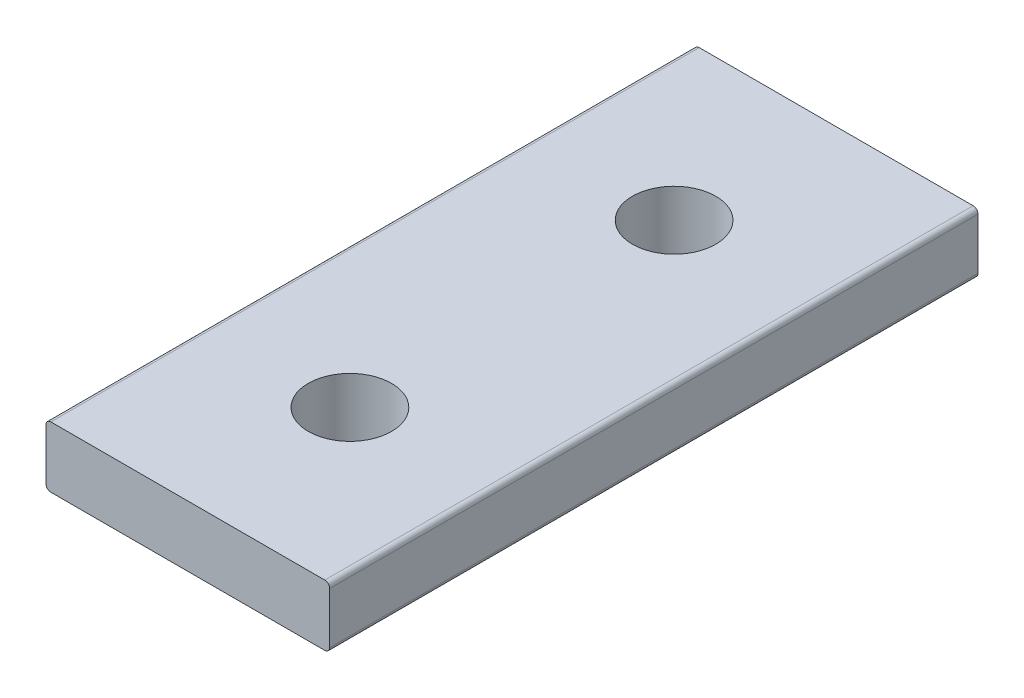
ISO-10303-21;
HEADER;
FILE_DESCRIPTION(('STEP AP214'),'2;1');
FILE_NAME('part.step','',(''),(''),'','','');
FILE_SCHEMA(('AUTOMOTIVE_DESIGN { 1 0 10303 214 1 1 1 1 }'));
ENDSEC;
DATA;
#1=APPLICATION_CONTEXT('core data for automotive mechanical design processes');
#2=APPLICATION_PROTOCOL_DEFINITION('international standard','automotive_design',2000,#1);
#3=PRODUCT_CONTEXT('',#1,'mechanical');
#4=PRODUCT('Part','Part','',(#3));
#5=PRODUCT_RELATED_PRODUCT_CATEGORY('part','',(#4));
#6=PRODUCT_DEFINITION_FORMATION('','',#4);
#7=PRODUCT_DEFINITION_CONTEXT('part definition',#1,'design');
#8=PRODUCT_DEFINITION('design','',#6,#7);
#9=PRODUCT_DEFINITION_SHAPE('','',#8);
#10=(LENGTH_UNIT() NAMED_UNIT(*) SI_UNIT(.MILLI.,.METRE.));
#11=(NAMED_UNIT(*) PLANE_ANGLE_UNIT() SI_UNIT($,.RADIAN.));
#12=(NAMED_UNIT(*) SI_UNIT($,.STERADIAN.) SOLID_ANGLE_UNIT());
#13=UNCERTAINTY_MEASURE_WITH_UNIT(LENGTH_MEASURE(1.E-05),#10,'distance_accuracy_value','');
#14=(GEOMETRIC_REPRESENTATION_CONTEXT(3) GLOBAL_UNCERTAINTY_ASSIGNED_CONTEXT((#13)) GLOBAL_UNIT_ASSIGNED_CONTEXT((#10,
#11,#12)) REPRESENTATION_CONTEXT('',''));
#15=CARTESIAN_POINT('',(0.,0.,0.));
#16=DIRECTION('',(0.,0.,1.));
#17=DIRECTION('',(1.,0.,0.));
#18=AXIS2_PLACEMENT_3D('',#15,#16,#17);
#19=CARTESIAN_POINT('',(-21.844,-4.3942,0.));
#20=DIRECTION('',(-1.,0.,0.));
#21=DIRECTION('',(0.,0.,1.));
#22=AXIS2_PLACEMENT_3D('',#19,#20,#21);
#23=PLANE('',#22);
#24=DIRECTION('',(0.,1.,0.));
#25=VECTOR('',#24,1.);
#26=CARTESIAN_POINT('',(-21.844,-4.7752,0.));
#27=LINE('',#26,#25);
#28=CARTESIAN_POINT('',(-21.844,-4.3942,0.));
#29=VERTEX_POINT('',#28);
#30=CARTESIAN_POINT('',(-21.844,-0.380999999999993,0.));
#31=VERTEX_POINT('',#30);
#32=EDGE_CURVE('E128',#29,#31,#27,.T.);
#33=ORIENTED_EDGE('',*,*,#32,.F.);
#34=DIRECTION('',(0.,0.,-1.));
#35=VECTOR('',#34,1.);
#36=CARTESIAN_POINT('',(-21.844,-4.3942,50.8));
#37=LINE('',#36,#35);
#38=CARTESIAN_POINT('',(-21.844,-4.3942,50.8));
#39=VERTEX_POINT('',#38);
#40=EDGE_CURVE('E121',#39,#29,#37,.T.);
#41=ORIENTED_EDGE('',*,*,#40,.F.);
#42=DIRECTION('',(0.,1.,0.));
#43=VECTOR('',#42,1.);
#44=CARTESIAN_POINT('',(-21.844,-4.7752,50.8));
#45=LINE('',#44,#43);
#46=CARTESIAN_POINT('',(-21.844,-0.380999999999993,50.8));
#47=VERTEX_POINT('',#46);
#48=EDGE_CURVE('E102',#47,#39,#45,.F.);
#49=ORIENTED_EDGE('',*,*,#48,.F.);
#50=DIRECTION('',(0.,0.,-1.));
#51=VECTOR('',#50,1.);
#52=CARTESIAN_POINT('',(-21.844,-0.380999999999993,50.8));
#53=LINE('',#52,#51);
#54=EDGE_CURVE('E87',#31,#47,#53,.F.);
#55=ORIENTED_EDGE('',*,*,#54,.F.);
#56=EDGE_LOOP('',(#33,#41,#49,#55));
#57=FACE_BOUND('',#56,.T.);
#58=ADVANCED_FACE('F15',(#57),#23,.T.);
#59=CARTESIAN_POINT('',(0.381000000000015,-4.3942,50.8));
#60=DIRECTION('',(1.,0.,0.));
#61=DIRECTION('',(0.,0.,-1.));
#62=AXIS2_PLACEMENT_3D('',#59,#60,#61);
#63=PLANE('',#62);
#64=DIRECTION('',(0.,1.,0.));
#65=VECTOR('',#64,1.);
#66=CARTESIAN_POINT('',(0.381000000000015,-4.7752,0.));
#67=LINE('',#66,#65);
#68=CARTESIAN_POINT('',(0.381000000000007,-0.380999999999993,0.));
#69=VERTEX_POINT('',#68);
#70=CARTESIAN_POINT('',(0.380999999999996,-4.3942,0.));
#71=VERTEX_POINT('',#70);
#72=EDGE_CURVE('E84',#69,#71,#67,.F.);
#73=ORIENTED_EDGE('',*,*,#72,.F.);
#74=DIRECTION('',(0.,0.,-1.));
#75=VECTOR('',#74,1.);
#76=CARTESIAN_POINT('',(0.380999999999999,-0.380999999999993,50.8));
#77=LINE('',#76,#75);
#78=CARTESIAN_POINT('',(0.381000000000008,-0.380999999999993,50.8));
#79=VERTEX_POINT('',#78);
#80=EDGE_CURVE('E19',#79,#69,#77,.T.);
#81=ORIENTED_EDGE('',*,*,#80,.F.);
#82=DIRECTION('',(0.,1.,0.));
#83=VECTOR('',#82,1.);
#84=CARTESIAN_POINT('',(0.381000000000017,-4.7752,50.8));
#85=LINE('',#84,#83);
#86=CARTESIAN_POINT('',(0.380999999999997,-4.3942,50.8));
#87=VERTEX_POINT('',#86);
#88=EDGE_CURVE('E82',#87,#79,#85,.T.);
#89=ORIENTED_EDGE('',*,*,#88,.F.);
#90=DIRECTION('',(0.,0.,-1.));
#91=VECTOR('',#90,1.);
#92=CARTESIAN_POINT('',(0.380999999999976,-4.3942,50.8));
#93=LINE('',#92,#91);
#94=EDGE_CURVE('E136',#71,#87,#93,.F.);
#95=ORIENTED_EDGE('',*,*,#94,.F.);
#96=EDGE_LOOP('',(#73,#81,#89,#95));
#97=FACE_BOUND('',#96,.T.);
#98=ADVANCED_FACE('F79',(#97),#63,.T.);
#99=CARTESIAN_POINT('',(0.,-0.380999999999993,50.8));
#100=DIRECTION('',(0.,0.,-1.));
#101=DIRECTION('',(-1.,0.,0.));
#102=AXIS2_PLACEMENT_3D('',#99,#100,#101);
#103=CYLINDRICAL_SURFACE('',#102,0.381);
#104=CARTESIAN_POINT('',(0.,-0.380999999999993,0.));
#105=DIRECTION('',(0.,0.,-1.));
#106=DIRECTION('',(-1.,0.,0.));
#107=AXIS2_PLACEMENT_3D('',#104,#105,#106);
#108=CIRCLE('',#107,0.381);
#109=CARTESIAN_POINT('',(0.,0.,0.));
#110=VERTEX_POINT('',#109);
#111=EDGE_CURVE('E131',#110,#69,#108,.T.);
#112=ORIENTED_EDGE('',*,*,#111,.F.);
#113=DIRECTION('',(0.,0.,1.));
#114=VECTOR('',#113,1.);
#115=CARTESIAN_POINT('',(0.,0.,0.));
#116=LINE('',#115,#114);
#117=CARTESIAN_POINT('',(0.,0.,50.8));
#118=VERTEX_POINT('',#117);
#119=EDGE_CURVE('E92',#118,#110,#116,.F.);
#120=ORIENTED_EDGE('',*,*,#119,.F.);
#121=CARTESIAN_POINT('',(0.,-0.380999999999993,50.8));
#122=DIRECTION('',(0.,0.,-1.));
#123=DIRECTION('',(-1.,0.,0.));
#124=AXIS2_PLACEMENT_3D('',#121,#122,#123);
#125=CIRCLE('',#124,0.381);
#126=EDGE_CURVE('E89',#79,#118,#125,.F.);
#127=ORIENTED_EDGE('',*,*,#126,.F.);
#128=ORIENTED_EDGE('',*,*,#80,.T.);
#129=EDGE_LOOP('',(#112,#120,#127,#128));
#130=FACE_BOUND('',#129,.T.);
#131=ADVANCED_FACE('F90',(#130),#103,.T.);
#132=CARTESIAN_POINT('',(-21.463,-0.380999999999993,50.8));
#133=DIRECTION('',(0.,0.,-1.));
#134=DIRECTION('',(-1.,0.,0.));
#135=AXIS2_PLACEMENT_3D('',#132,#133,#134);
#136=CYLINDRICAL_SURFACE('',#135,0.380999999999993);
#137=CARTESIAN_POINT('',(-21.463,-0.380999999999993,0.));
#138=DIRECTION('',(0.,0.,-1.));
#139=DIRECTION('',(-1.,0.,0.));
#140=AXIS2_PLACEMENT_3D('',#137,#138,#139);
#141=CIRCLE('',#140,0.380999999999993);
#142=CARTESIAN_POINT('',(-21.463,0.,0.));
#143=VERTEX_POINT('',#142);
#144=EDGE_CURVE('E112',#31,#143,#141,.T.);
#145=ORIENTED_EDGE('',*,*,#144,.F.);
#146=ORIENTED_EDGE('',*,*,#54,.T.);
#147=CARTESIAN_POINT('',(-21.463,-0.380999999999993,50.8));
#148=DIRECTION('',(0.,0.,-1.));
#149=DIRECTION('',(-1.,0.,0.));
#150=AXIS2_PLACEMENT_3D('',#147,#148,#149);
#151=CIRCLE('',#150,0.380999999999993);
#152=CARTESIAN_POINT('',(-21.463,0.,50.8));
#153=VERTEX_POINT('',#152);
#154=EDGE_CURVE('E96',#153,#47,#151,.F.);
#155=ORIENTED_EDGE('',*,*,#154,.F.);
#156=DIRECTION('',(0.,0.,1.));
#157=VECTOR('',#156,1.);
#158=CARTESIAN_POINT('',(-21.463,0.,0.));
#159=LINE('',#158,#157);
#160=EDGE_CURVE('E143',#143,#153,#159,.T.);
#161=ORIENTED_EDGE('',*,*,#160,.F.);
#162=EDGE_LOOP('',(#145,#146,#155,#161));
#163=FACE_BOUND('',#162,.T.);
#164=ADVANCED_FACE('F110',(#163),#136,.T.);
#165=CARTESIAN_POINT('',(-21.844,-4.7752,50.8));
#166=DIRECTION('',(0.,0.,1.));
#167=DIRECTION('',(1.,0.,0.));
#168=AXIS2_PLACEMENT_3D('',#165,#166,#167);
#169=PLANE('',#168);
#170=DIRECTION('',(1.,0.,0.));
#171=VECTOR('',#170,1.);
#172=CARTESIAN_POINT('',(-21.463,0.,50.8));
#173=LINE('',#172,#171);
#174=EDGE_CURVE('E117',#153,#118,#173,.T.);
#175=ORIENTED_EDGE('',*,*,#174,.F.);
#176=ORIENTED_EDGE('',*,*,#154,.T.);
#177=ORIENTED_EDGE('',*,*,#48,.T.);
#178=CARTESIAN_POINT('',(-21.463,-4.3942,50.8));
#179=DIRECTION('',(0.,0.,-1.));
#180=DIRECTION('',(-1.,0.,0.));
#181=AXIS2_PLACEMENT_3D('',#178,#179,#180);
#182=CIRCLE('',#181,0.380999999999994);
#183=CARTESIAN_POINT('',(-21.463,-4.7752,50.8));
#184=VERTEX_POINT('',#183);
#185=EDGE_CURVE('E119',#184,#39,#182,.T.);
#186=ORIENTED_EDGE('',*,*,#185,.F.);
#187=DIRECTION('',(1.,0.,0.));
#188=VECTOR('',#187,1.);
#189=CARTESIAN_POINT('',(-21.463,-4.7752,50.8));
#190=LINE('',#189,#188);
#191=CARTESIAN_POINT('',(0.,-4.7752,50.8));
#192=VERTEX_POINT('',#191);
#193=EDGE_CURVE('E148',#192,#184,#190,.F.);
#194=ORIENTED_EDGE('',*,*,#193,.F.);
#195=CARTESIAN_POINT('',(0.,-4.3942,50.8));
#196=DIRECTION('',(0.,0.,-1.));
#197=DIRECTION('',(-1.,0.,0.));
#198=AXIS2_PLACEMENT_3D('',#195,#196,#197);
#199=CIRCLE('',#198,0.380999999999988);
#200=EDGE_CURVE('E100',#87,#192,#199,.T.);
#201=ORIENTED_EDGE('',*,*,#200,.F.);
#202=ORIENTED_EDGE('',*,*,#88,.T.);
#203=ORIENTED_EDGE('',*,*,#126,.T.);
#204=EDGE_LOOP('',(#175,#176,#177,#186,#194,#201,#202,#203));
#205=FACE_BOUND('',#204,.T.);
#206=ADVANCED_FACE('F98',(#205),#169,.T.);
#207=CARTESIAN_POINT('',(-21.463,-4.3942,50.8));
#208=DIRECTION('',(0.,0.,-1.));
#209=DIRECTION('',(-1.,0.,0.));
#210=AXIS2_PLACEMENT_3D('',#207,#208,#209);
#211=CYLINDRICAL_SURFACE('',#210,0.380999999999994);
#212=CARTESIAN_POINT('',(-21.463,-4.3942,0.));
#213=DIRECTION('',(0.,0.,-1.));
#214=DIRECTION('',(-1.,0.,0.));
#215=AXIS2_PLACEMENT_3D('',#212,#213,#214);
#216=CIRCLE('',#215,0.380999999999994);
#217=CARTESIAN_POINT('',(-21.463,-4.7752,0.));
#218=VERTEX_POINT('',#217);
#219=EDGE_CURVE('E125',#218,#29,#216,.T.);
#220=ORIENTED_EDGE('',*,*,#219,.F.);
#221=DIRECTION('',(0.,0.,-1.));
#222=VECTOR('',#221,1.);
#223=CARTESIAN_POINT('',(-21.463,-4.7752,50.8));
#224=LINE('',#223,#222);
#225=EDGE_CURVE('E151',#184,#218,#224,.T.);
#226=ORIENTED_EDGE('',*,*,#225,.F.);
#227=ORIENTED_EDGE('',*,*,#185,.T.);
#228=ORIENTED_EDGE('',*,*,#40,.T.);
#229=EDGE_LOOP('',(#220,#226,#227,#228));
#230=FACE_BOUND('',#229,.T.);
#231=ADVANCED_FACE('F180',(#230),#211,.T.);
#232=CARTESIAN_POINT('',(0.381000000000015,-4.7752,0.));
#233=DIRECTION('',(0.,0.,-1.));
#234=DIRECTION('',(-1.,0.,0.));
#235=AXIS2_PLACEMENT_3D('',#232,#233,#234);
#236=PLANE('',#235);
#237=CARTESIAN_POINT('',(0.,-4.3942,0.));
#238=DIRECTION('',(0.,0.,-1.));
#239=DIRECTION('',(-1.,0.,0.));
#240=AXIS2_PLACEMENT_3D('',#237,#238,#239);
#241=CIRCLE('',#240,0.380999999999988);
#242=CARTESIAN_POINT('',(0.,-4.7752,0.));
#243=VERTEX_POINT('',#242);
#244=EDGE_CURVE('E34',#243,#71,#241,.F.);
#245=ORIENTED_EDGE('',*,*,#244,.F.);
#246=DIRECTION('',(1.,0.,0.));
#247=VECTOR('',#246,1.);
#248=CARTESIAN_POINT('',(-21.463,-4.7752,0.));
#249=LINE('',#248,#247);
#250=EDGE_CURVE('E154',#218,#243,#249,.T.);
#251=ORIENTED_EDGE('',*,*,#250,.F.);
#252=ORIENTED_EDGE('',*,*,#219,.T.);
#253=ORIENTED_EDGE('',*,*,#32,.T.);
#254=ORIENTED_EDGE('',*,*,#144,.T.);
#255=DIRECTION('',(1.,0.,0.));
#256=VECTOR('',#255,1.);
#257=CARTESIAN_POINT('',(-21.463,0.,0.));
#258=LINE('',#257,#256);
#259=EDGE_CURVE('E140',#110,#143,#258,.F.);
#260=ORIENTED_EDGE('',*,*,#259,.F.);
#261=ORIENTED_EDGE('',*,*,#111,.T.);
#262=ORIENTED_EDGE('',*,*,#72,.T.);
#263=EDGE_LOOP('',(#245,#251,#252,#253,#254,#260,#261,#262));
#264=FACE_BOUND('',#263,.T.);
#265=ADVANCED_FACE('F177',(#264),#236,.T.);
#266=CARTESIAN_POINT('',(0.,-4.3942,50.8));
#267=DIRECTION('',(0.,0.,-1.));
#268=DIRECTION('',(-1.,0.,0.));
#269=AXIS2_PLACEMENT_3D('',#266,#267,#268);
#270=CYLINDRICAL_SURFACE('',#269,0.380999999999988);
#271=ORIENTED_EDGE('',*,*,#244,.T.);
#272=ORIENTED_EDGE('',*,*,#94,.T.);
#273=ORIENTED_EDGE('',*,*,#200,.T.);
#274=DIRECTION('',(0.,0.,-1.));
#275=VECTOR('',#274,1.);
#276=CARTESIAN_POINT('',(0.,-4.7752,50.8));
#277=LINE('',#276,#275);
#278=EDGE_CURVE('E157',#243,#192,#277,.F.);
#279=ORIENTED_EDGE('',*,*,#278,.F.);
#280=EDGE_LOOP('',(#271,#272,#273,#279));
#281=FACE_BOUND('',#280,.T.);
#282=ADVANCED_FACE('F183',(#281),#270,.T.);
#283=CARTESIAN_POINT('',(-10.7315,-4.7752,12.7));
#284=DIRECTION('',(0.,1.,0.));
#285=DIRECTION('',(0.,0.,1.));
#286=AXIS2_PLACEMENT_3D('',#283,#284,#285);
#287=CYLINDRICAL_SURFACE('',#286,3.26390000000001);
#288=CARTESIAN_POINT('',(-10.7315,0.,12.7));
#289=DIRECTION('',(0.,1.,0.));
#290=DIRECTION('',(0.,0.,1.));
#291=AXIS2_PLACEMENT_3D('',#288,#289,#290);
#292=CIRCLE('',#291,3.26390000000001);
#293=CARTESIAN_POINT('',(-10.7315,0.,15.9639));
#294=VERTEX_POINT('',#293);
#295=EDGE_CURVE('E145',#294,#294,#292,.F.);
#296=ORIENTED_EDGE('',*,*,#295,.F.);
#297=EDGE_LOOP('',(#296));
#298=FACE_BOUND('',#297,.T.);
#299=CARTESIAN_POINT('',(-10.7315,-4.7752,12.7));
#300=DIRECTION('',(0.,1.,0.));
#301=DIRECTION('',(0.,0.,1.));
#302=AXIS2_PLACEMENT_3D('',#299,#300,#301);
#303=CIRCLE('',#302,3.26390000000001);
#304=CARTESIAN_POINT('',(-10.7315,-4.7752,15.9639));
#305=VERTEX_POINT('',#304);
#306=EDGE_CURVE('E160',#305,#305,#303,.T.);
#307=ORIENTED_EDGE('',*,*,#306,.F.);
#308=EDGE_LOOP('',(#307));
#309=FACE_BOUND('',#308,.T.);
#310=ADVANCED_FACE('F172',(#298,#309),#287,.F.);
#311=CARTESIAN_POINT('',(-21.463,0.,0.));
#312=DIRECTION('',(0.,1.,0.));
#313=DIRECTION('',(0.,0.,1.));
#314=AXIS2_PLACEMENT_3D('',#311,#312,#313);
#315=PLANE('',#314);
#316=CARTESIAN_POINT('',(-10.7315,0.,38.1));
#317=DIRECTION('',(0.,1.,0.));
#318=DIRECTION('',(0.,0.,1.));
#319=AXIS2_PLACEMENT_3D('',#316,#317,#318);
#320=CIRCLE('',#319,3.2639);
#321=CARTESIAN_POINT('',(-10.7315,0.,41.3639));
#322=VERTEX_POINT('',#321);
#323=EDGE_CURVE('E25',#322,#322,#320,.T.);
#324=ORIENTED_EDGE('',*,*,#323,.F.);
#325=EDGE_LOOP('',(#324));
#326=FACE_BOUND('',#325,.T.);
#327=ORIENTED_EDGE('',*,*,#295,.T.);
#328=EDGE_LOOP('',(#327));
#329=FACE_BOUND('',#328,.T.);
#330=ORIENTED_EDGE('',*,*,#259,.T.);
#331=ORIENTED_EDGE('',*,*,#160,.T.);
#332=ORIENTED_EDGE('',*,*,#174,.T.);
#333=ORIENTED_EDGE('',*,*,#119,.T.);
#334=EDGE_LOOP('',(#330,#331,#332,#333));
#335=FACE_BOUND('',#334,.T.);
#336=ADVANCED_FACE('F168',(#326,#329,#335),#315,.T.);
#337=CARTESIAN_POINT('',(-21.463,-4.7752,50.8));
#338=DIRECTION('',(0.,-1.,0.));
#339=DIRECTION('',(0.,0.,-1.));
#340=AXIS2_PLACEMENT_3D('',#337,#338,#339);
#341=PLANE('',#340);
#342=CARTESIAN_POINT('',(-10.7315,-4.7752,38.1));
#343=DIRECTION('',(0.,1.,0.));
#344=DIRECTION('',(0.,0.,1.));
#345=AXIS2_PLACEMENT_3D('',#342,#343,#344);
#346=CIRCLE('',#345,3.2639);
#347=CARTESIAN_POINT('',(-10.7315,-4.7752,41.3639));
#348=VERTEX_POINT('',#347);
#349=EDGE_CURVE('E9',#348,#348,#346,.F.);
#350=ORIENTED_EDGE('',*,*,#349,.F.);
#351=EDGE_LOOP('',(#350));
#352=FACE_BOUND('',#351,.T.);
#353=ORIENTED_EDGE('',*,*,#306,.T.);
#354=EDGE_LOOP('',(#353));
#355=FACE_BOUND('',#354,.T.);
#356=ORIENTED_EDGE('',*,*,#250,.T.);
#357=ORIENTED_EDGE('',*,*,#278,.T.);
#358=ORIENTED_EDGE('',*,*,#193,.T.);
#359=ORIENTED_EDGE('',*,*,#225,.T.);
#360=EDGE_LOOP('',(#356,#357,#358,#359));
#361=FACE_BOUND('',#360,.T.);
#362=ADVANCED_FACE('F171',(#352,#355,#361),#341,.T.);
#363=CARTESIAN_POINT('',(-10.7315,-4.7752,38.1));
#364=DIRECTION('',(0.,1.,0.));
#365=DIRECTION('',(0.,0.,1.));
#366=AXIS2_PLACEMENT_3D('',#363,#364,#365);
#367=CYLINDRICAL_SURFACE('',#366,3.2639);
#368=ORIENTED_EDGE('',*,*,#323,.T.);
#369=EDGE_LOOP('',(#368));
#370=FACE_BOUND('',#369,.T.);
#371=ORIENTED_EDGE('',*,*,#349,.T.);
#372=EDGE_LOOP('',(#371));
#373=FACE_BOUND('',#372,.T.);
#374=ADVANCED_FACE('F17',(#370,#373),#367,.F.);
#375=CLOSED_SHELL('',(#58,#98,#131,#164,#206,#231,#265,#282,#310,#336,#362,#374));
#376=MANIFOLD_SOLID_BREP('B1',#375);
#377=ADVANCED_BREP_SHAPE_REPRESENTATION('',(#18,#376),#14);
#378=SHAPE_DEFINITION_REPRESENTATION(#9,#377);
ENDSEC;
END-ISO-10303-21;
